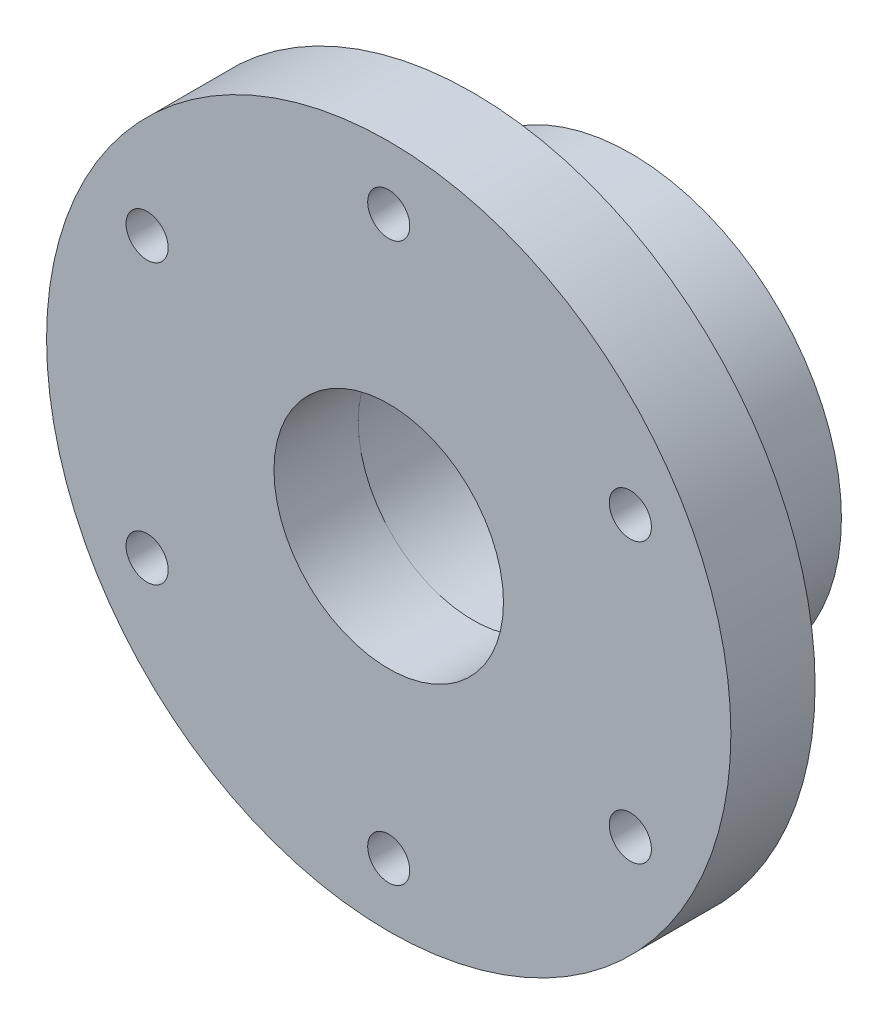
ISO-10303-21;
HEADER;
FILE_DESCRIPTION(('STEP AP214'),'2;1');
FILE_NAME('part.step','',(''),(''),'','','');
FILE_SCHEMA(('AUTOMOTIVE_DESIGN { 1 0 10303 214 1 1 1 1 }'));
ENDSEC;
DATA;
#1=APPLICATION_CONTEXT('core data for automotive mechanical design processes');
#2=APPLICATION_PROTOCOL_DEFINITION('international standard','automotive_design',2000,#1);
#3=PRODUCT_CONTEXT('',#1,'mechanical');
#4=PRODUCT('Part','Part','',(#3));
#5=PRODUCT_RELATED_PRODUCT_CATEGORY('part','',(#4));
#6=PRODUCT_DEFINITION_FORMATION('','',#4);
#7=PRODUCT_DEFINITION_CONTEXT('part definition',#1,'design');
#8=PRODUCT_DEFINITION('design','',#6,#7);
#9=PRODUCT_DEFINITION_SHAPE('','',#8);
#10=(LENGTH_UNIT() NAMED_UNIT(*) SI_UNIT(.MILLI.,.METRE.));
#11=(NAMED_UNIT(*) PLANE_ANGLE_UNIT() SI_UNIT($,.RADIAN.));
#12=(NAMED_UNIT(*) SI_UNIT($,.STERADIAN.) SOLID_ANGLE_UNIT());
#13=UNCERTAINTY_MEASURE_WITH_UNIT(LENGTH_MEASURE(1.E-05),#10,'distance_accuracy_value','');
#14=(GEOMETRIC_REPRESENTATION_CONTEXT(3) GLOBAL_UNCERTAINTY_ASSIGNED_CONTEXT((#13)) GLOBAL_UNIT_ASSIGNED_CONTEXT((#10,
#11,#12)) REPRESENTATION_CONTEXT('',''));
#15=CARTESIAN_POINT('',(0.,0.,0.));
#16=DIRECTION('',(0.,0.,1.));
#17=DIRECTION('',(1.,0.,0.));
#18=AXIS2_PLACEMENT_3D('',#15,#16,#17);
#19=CARTESIAN_POINT('',(0.,0.,50.));
#20=DIRECTION('',(0.,0.,1.));
#21=DIRECTION('',(1.,0.,0.));
#22=AXIS2_PLACEMENT_3D('',#19,#20,#21);
#23=PLANE('',#22);
#24=CARTESIAN_POINT('',(0.,0.,50.));
#25=DIRECTION('',(0.,0.,1.));
#26=DIRECTION('',(1.,0.,0.));
#27=AXIS2_PLACEMENT_3D('',#24,#25,#26);
#28=CIRCLE('',#27,20.);
#29=CARTESIAN_POINT('',(20.,0.,50.));
#30=VERTEX_POINT('',#29);
#31=EDGE_CURVE('E33',#30,#30,#28,.T.);
#32=ORIENTED_EDGE('',*,*,#31,.F.);
#33=EDGE_LOOP('',(#32));
#34=FACE_BOUND('',#33,.T.);
#35=CARTESIAN_POINT('',(0.,0.,50.));
#36=DIRECTION('',(0.,0.,1.));
#37=DIRECTION('',(1.,0.,0.));
#38=AXIS2_PLACEMENT_3D('',#35,#36,#37);
#39=CIRCLE('',#38,11.);
#40=CARTESIAN_POINT('',(11.,0.,50.));
#41=VERTEX_POINT('',#40);
#42=EDGE_CURVE('E40',#41,#41,#39,.T.);
#43=ORIENTED_EDGE('',*,*,#42,.T.);
#44=EDGE_LOOP('',(#43));
#45=FACE_BOUND('',#44,.T.);
#46=ADVANCED_FACE('F29',(#34,#45),#23,.F.);
#47=CARTESIAN_POINT('',(0.,0.,65.));
#48=DIRECTION('',(0.,0.,-1.));
#49=DIRECTION('',(-1.,0.,0.));
#50=AXIS2_PLACEMENT_3D('',#47,#48,#49);
#51=CYLINDRICAL_SURFACE('',#50,20.);
#52=CARTESIAN_POINT('',(0.,0.,65.));
#53=DIRECTION('',(0.,0.,1.));
#54=DIRECTION('',(1.,0.,0.));
#55=AXIS2_PLACEMENT_3D('',#52,#53,#54);
#56=CIRCLE('',#55,20.);
#57=CARTESIAN_POINT('',(20.,0.,65.));
#58=VERTEX_POINT('',#57);
#59=EDGE_CURVE('E10',#58,#58,#56,.T.);
#60=ORIENTED_EDGE('',*,*,#59,.F.);
#61=EDGE_LOOP('',(#60));
#62=FACE_BOUND('',#61,.T.);
#63=ORIENTED_EDGE('',*,*,#31,.T.);
#64=EDGE_LOOP('',(#63));
#65=FACE_BOUND('',#64,.T.);
#66=ADVANCED_FACE('F31',(#62,#65),#51,.T.);
#67=CARTESIAN_POINT('',(0.,0.,65.));
#68=DIRECTION('',(0.,0.,-1.));
#69=DIRECTION('',(-1.,0.,0.));
#70=AXIS2_PLACEMENT_3D('',#67,#68,#69);
#71=CYLINDRICAL_SURFACE('',#70,11.);
#72=CARTESIAN_POINT('',(0.,0.,65.));
#73=DIRECTION('',(0.,0.,1.));
#74=DIRECTION('',(1.,0.,0.));
#75=AXIS2_PLACEMENT_3D('',#72,#73,#74);
#76=CIRCLE('',#75,11.);
#77=CARTESIAN_POINT('',(11.,0.,65.));
#78=VERTEX_POINT('',#77);
#79=EDGE_CURVE('E44',#78,#78,#76,.T.);
#80=ORIENTED_EDGE('',*,*,#79,.T.);
#81=EDGE_LOOP('',(#80));
#82=FACE_BOUND('',#81,.T.);
#83=ORIENTED_EDGE('',*,*,#42,.F.);
#84=EDGE_LOOP('',(#83));
#85=FACE_BOUND('',#84,.T.);
#86=ADVANCED_FACE('F109',(#82,#85),#71,.F.);
#87=CARTESIAN_POINT('',(0.,0.,65.));
#88=DIRECTION('',(0.,0.,1.));
#89=DIRECTION('',(1.,0.,0.));
#90=AXIS2_PLACEMENT_3D('',#87,#88,#89);
#91=PLANE('',#90);
#92=CARTESIAN_POINT('',(22.9496732002876,13.25,65.));
#93=DIRECTION('',(0.,0.,-1.));
#94=DIRECTION('',(-1.,0.,0.));
#95=AXIS2_PLACEMENT_3D('',#92,#93,#94);
#96=CIRCLE('',#95,2.);
#97=CARTESIAN_POINT('',(20.9496732002876,13.25,65.));
#98=VERTEX_POINT('',#97);
#99=EDGE_CURVE('E90',#98,#98,#96,.T.);
#100=ORIENTED_EDGE('',*,*,#99,.F.);
#101=EDGE_LOOP('',(#100));
#102=FACE_BOUND('',#101,.T.);
#103=CARTESIAN_POINT('',(22.9496732002876,-13.25,65.));
#104=DIRECTION('',(0.,0.,-1.));
#105=DIRECTION('',(-1.,0.,0.));
#106=AXIS2_PLACEMENT_3D('',#103,#104,#105);
#107=CIRCLE('',#106,2.);
#108=CARTESIAN_POINT('',(20.9496732002876,-13.25,65.));
#109=VERTEX_POINT('',#108);
#110=EDGE_CURVE('E84',#109,#109,#107,.T.);
#111=ORIENTED_EDGE('',*,*,#110,.F.);
#112=EDGE_LOOP('',(#111));
#113=FACE_BOUND('',#112,.T.);
#114=CARTESIAN_POINT('',(0.,-26.5,65.));
#115=DIRECTION('',(0.,0.,-1.));
#116=DIRECTION('',(-1.,0.,0.));
#117=AXIS2_PLACEMENT_3D('',#114,#115,#116);
#118=CIRCLE('',#117,2.);
#119=CARTESIAN_POINT('',(-2.00000000000001,-26.5,65.));
#120=VERTEX_POINT('',#119);
#121=EDGE_CURVE('E78',#120,#120,#118,.T.);
#122=ORIENTED_EDGE('',*,*,#121,.F.);
#123=EDGE_LOOP('',(#122));
#124=FACE_BOUND('',#123,.T.);
#125=CARTESIAN_POINT('',(-22.9496732002876,-13.25,65.));
#126=DIRECTION('',(0.,0.,-1.));
#127=DIRECTION('',(-1.,0.,0.));
#128=AXIS2_PLACEMENT_3D('',#125,#126,#127);
#129=CIRCLE('',#128,2.);
#130=CARTESIAN_POINT('',(-24.9496732002876,-13.25,65.));
#131=VERTEX_POINT('',#130);
#132=EDGE_CURVE('E72',#131,#131,#129,.T.);
#133=ORIENTED_EDGE('',*,*,#132,.F.);
#134=EDGE_LOOP('',(#133));
#135=FACE_BOUND('',#134,.T.);
#136=CARTESIAN_POINT('',(-22.9496732002876,13.25,65.));
#137=DIRECTION('',(0.,0.,-1.));
#138=DIRECTION('',(-1.,0.,0.));
#139=AXIS2_PLACEMENT_3D('',#136,#137,#138);
#140=CIRCLE('',#139,2.);
#141=CARTESIAN_POINT('',(-24.9496732002876,13.25,65.));
#142=VERTEX_POINT('',#141);
#143=EDGE_CURVE('E66',#142,#142,#140,.T.);
#144=ORIENTED_EDGE('',*,*,#143,.F.);
#145=EDGE_LOOP('',(#144));
#146=FACE_BOUND('',#145,.T.);
#147=CARTESIAN_POINT('',(0.,26.5,65.));
#148=DIRECTION('',(0.,0.,-1.));
#149=DIRECTION('',(-1.,0.,0.));
#150=AXIS2_PLACEMENT_3D('',#147,#148,#149);
#151=CIRCLE('',#150,2.);
#152=CARTESIAN_POINT('',(-2.,26.5,65.));
#153=VERTEX_POINT('',#152);
#154=EDGE_CURVE('E60',#153,#153,#151,.T.);
#155=ORIENTED_EDGE('',*,*,#154,.F.);
#156=EDGE_LOOP('',(#155));
#157=FACE_BOUND('',#156,.T.);
#158=CARTESIAN_POINT('',(0.,0.,65.));
#159=DIRECTION('',(0.,0.,1.));
#160=DIRECTION('',(1.,0.,0.));
#161=AXIS2_PLACEMENT_3D('',#158,#159,#160);
#162=CIRCLE('',#161,32.5);
#163=CARTESIAN_POINT('',(32.5,0.,65.));
#164=VERTEX_POINT('',#163);
#165=EDGE_CURVE('E48',#164,#164,#162,.T.);
#166=ORIENTED_EDGE('',*,*,#165,.F.);
#167=EDGE_LOOP('',(#166));
#168=FACE_BOUND('',#167,.T.);
#169=ORIENTED_EDGE('',*,*,#59,.T.);
#170=EDGE_LOOP('',(#169));
#171=FACE_BOUND('',#170,.T.);
#172=ADVANCED_FACE('F106',(#102,#113,#124,#135,#146,#157,#168,#171),#91,.F.);
#173=CARTESIAN_POINT('',(0.,0.,73.));
#174=DIRECTION('',(0.,0.,1.));
#175=DIRECTION('',(1.,0.,0.));
#176=AXIS2_PLACEMENT_3D('',#173,#174,#175);
#177=PLANE('',#176);
#178=CARTESIAN_POINT('',(22.9496732002876,13.25,73.));
#179=DIRECTION('',(0.,0.,-1.));
#180=DIRECTION('',(-1.,0.,0.));
#181=AXIS2_PLACEMENT_3D('',#178,#179,#180);
#182=CIRCLE('',#181,2.);
#183=CARTESIAN_POINT('',(20.9496732002876,13.25,73.));
#184=VERTEX_POINT('',#183);
#185=EDGE_CURVE('E87',#184,#184,#182,.T.);
#186=ORIENTED_EDGE('',*,*,#185,.T.);
#187=EDGE_LOOP('',(#186));
#188=FACE_BOUND('',#187,.T.);
#189=CARTESIAN_POINT('',(22.9496732002876,-13.25,73.));
#190=DIRECTION('',(0.,0.,-1.));
#191=DIRECTION('',(-1.,0.,0.));
#192=AXIS2_PLACEMENT_3D('',#189,#190,#191);
#193=CIRCLE('',#192,2.);
#194=CARTESIAN_POINT('',(20.9496732002876,-13.25,73.));
#195=VERTEX_POINT('',#194);
#196=EDGE_CURVE('E81',#195,#195,#193,.T.);
#197=ORIENTED_EDGE('',*,*,#196,.T.);
#198=EDGE_LOOP('',(#197));
#199=FACE_BOUND('',#198,.T.);
#200=CARTESIAN_POINT('',(0.,-26.5,73.));
#201=DIRECTION('',(0.,0.,-1.));
#202=DIRECTION('',(-1.,0.,0.));
#203=AXIS2_PLACEMENT_3D('',#200,#201,#202);
#204=CIRCLE('',#203,2.);
#205=CARTESIAN_POINT('',(-2.00000000000001,-26.5,73.));
#206=VERTEX_POINT('',#205);
#207=EDGE_CURVE('E75',#206,#206,#204,.T.);
#208=ORIENTED_EDGE('',*,*,#207,.T.);
#209=EDGE_LOOP('',(#208));
#210=FACE_BOUND('',#209,.T.);
#211=CARTESIAN_POINT('',(-22.9496732002876,-13.25,73.));
#212=DIRECTION('',(0.,0.,-1.));
#213=DIRECTION('',(-1.,0.,0.));
#214=AXIS2_PLACEMENT_3D('',#211,#212,#213);
#215=CIRCLE('',#214,2.);
#216=CARTESIAN_POINT('',(-24.9496732002876,-13.25,73.));
#217=VERTEX_POINT('',#216);
#218=EDGE_CURVE('E69',#217,#217,#215,.T.);
#219=ORIENTED_EDGE('',*,*,#218,.T.);
#220=EDGE_LOOP('',(#219));
#221=FACE_BOUND('',#220,.T.);
#222=CARTESIAN_POINT('',(-22.9496732002876,13.25,73.));
#223=DIRECTION('',(0.,0.,-1.));
#224=DIRECTION('',(-1.,0.,0.));
#225=AXIS2_PLACEMENT_3D('',#222,#223,#224);
#226=CIRCLE('',#225,2.);
#227=CARTESIAN_POINT('',(-24.9496732002876,13.25,73.));
#228=VERTEX_POINT('',#227);
#229=EDGE_CURVE('E63',#228,#228,#226,.T.);
#230=ORIENTED_EDGE('',*,*,#229,.T.);
#231=EDGE_LOOP('',(#230));
#232=FACE_BOUND('',#231,.T.);
#233=CARTESIAN_POINT('',(0.,26.5,73.));
#234=DIRECTION('',(0.,0.,-1.));
#235=DIRECTION('',(-1.,0.,0.));
#236=AXIS2_PLACEMENT_3D('',#233,#234,#235);
#237=CIRCLE('',#236,2.);
#238=CARTESIAN_POINT('',(-2.,26.5,73.));
#239=VERTEX_POINT('',#238);
#240=EDGE_CURVE('E57',#239,#239,#237,.T.);
#241=ORIENTED_EDGE('',*,*,#240,.T.);
#242=EDGE_LOOP('',(#241));
#243=FACE_BOUND('',#242,.T.);
#244=CARTESIAN_POINT('',(0.,0.,73.));
#245=DIRECTION('',(0.,0.,1.));
#246=DIRECTION('',(1.,0.,0.));
#247=AXIS2_PLACEMENT_3D('',#244,#245,#246);
#248=CIRCLE('',#247,32.5);
#249=CARTESIAN_POINT('',(32.5,0.,73.));
#250=VERTEX_POINT('',#249);
#251=EDGE_CURVE('E47',#250,#250,#248,.T.);
#252=ORIENTED_EDGE('',*,*,#251,.T.);
#253=EDGE_LOOP('',(#252));
#254=FACE_BOUND('',#253,.T.);
#255=CARTESIAN_POINT('',(0.,0.,73.));
#256=DIRECTION('',(0.,0.,1.));
#257=DIRECTION('',(1.,0.,0.));
#258=AXIS2_PLACEMENT_3D('',#255,#256,#257);
#259=CIRCLE('',#258,10.9);
#260=CARTESIAN_POINT('',(10.9,0.,73.));
#261=VERTEX_POINT('',#260);
#262=EDGE_CURVE('E51',#261,#261,#259,.T.);
#263=ORIENTED_EDGE('',*,*,#262,.F.);
#264=EDGE_LOOP('',(#263));
#265=FACE_BOUND('',#264,.T.);
#266=ADVANCED_FACE('F96',(#188,#199,#210,#221,#232,#243,#254,#265),#177,.T.);
#267=ORIENTED_EDGE('',*,*,#79,.F.);
#268=EDGE_LOOP('',(#267));
#269=FACE_BOUND('',#268,.T.);
#270=CARTESIAN_POINT('',(0.,0.,65.));
#271=DIRECTION('',(0.,0.,1.));
#272=DIRECTION('',(1.,0.,0.));
#273=AXIS2_PLACEMENT_3D('',#270,#271,#272);
#274=CIRCLE('',#273,10.9);
#275=CARTESIAN_POINT('',(10.9,0.,65.));
#276=VERTEX_POINT('',#275);
#277=EDGE_CURVE('E54',#276,#276,#274,.T.);
#278=ORIENTED_EDGE('',*,*,#277,.T.);
#279=EDGE_LOOP('',(#278));
#280=FACE_BOUND('',#279,.T.);
#281=ADVANCED_FACE('F111',(#269,#280),#91,.F.);
#282=CARTESIAN_POINT('',(0.,0.,73.));
#283=DIRECTION('',(0.,0.,-1.));
#284=DIRECTION('',(-1.,0.,0.));
#285=AXIS2_PLACEMENT_3D('',#282,#283,#284);
#286=CYLINDRICAL_SURFACE('',#285,32.5);
#287=ORIENTED_EDGE('',*,*,#251,.F.);
#288=EDGE_LOOP('',(#287));
#289=FACE_BOUND('',#288,.T.);
#290=ORIENTED_EDGE('',*,*,#165,.T.);
#291=EDGE_LOOP('',(#290));
#292=FACE_BOUND('',#291,.T.);
#293=ADVANCED_FACE('F124',(#289,#292),#286,.T.);
#294=CARTESIAN_POINT('',(0.,0.,73.));
#295=DIRECTION('',(0.,0.,-1.));
#296=DIRECTION('',(-1.,0.,0.));
#297=AXIS2_PLACEMENT_3D('',#294,#295,#296);
#298=CYLINDRICAL_SURFACE('',#297,10.9);
#299=ORIENTED_EDGE('',*,*,#262,.T.);
#300=EDGE_LOOP('',(#299));
#301=FACE_BOUND('',#300,.T.);
#302=ORIENTED_EDGE('',*,*,#277,.F.);
#303=EDGE_LOOP('',(#302));
#304=FACE_BOUND('',#303,.T.);
#305=ADVANCED_FACE('F126',(#301,#304),#298,.F.);
#306=CARTESIAN_POINT('',(0.,26.5,73.));
#307=DIRECTION('',(0.,0.,-1.));
#308=DIRECTION('',(-1.,0.,0.));
#309=AXIS2_PLACEMENT_3D('',#306,#307,#308);
#310=CYLINDRICAL_SURFACE('',#309,2.);
#311=ORIENTED_EDGE('',*,*,#240,.F.);
#312=EDGE_LOOP('',(#311));
#313=FACE_BOUND('',#312,.T.);
#314=ORIENTED_EDGE('',*,*,#154,.T.);
#315=EDGE_LOOP('',(#314));
#316=FACE_BOUND('',#315,.T.);
#317=ADVANCED_FACE('F133',(#313,#316),#310,.F.);
#318=CARTESIAN_POINT('',(-22.9496732002876,13.25,73.));
#319=DIRECTION('',(0.,0.,-1.));
#320=DIRECTION('',(-1.,0.,0.));
#321=AXIS2_PLACEMENT_3D('',#318,#319,#320);
#322=CYLINDRICAL_SURFACE('',#321,2.);
#323=ORIENTED_EDGE('',*,*,#229,.F.);
#324=EDGE_LOOP('',(#323));
#325=FACE_BOUND('',#324,.T.);
#326=ORIENTED_EDGE('',*,*,#143,.T.);
#327=EDGE_LOOP('',(#326));
#328=FACE_BOUND('',#327,.T.);
#329=ADVANCED_FACE('F192',(#325,#328),#322,.F.);
#330=CARTESIAN_POINT('',(-22.9496732002876,-13.25,73.));
#331=DIRECTION('',(0.,0.,-1.));
#332=DIRECTION('',(-1.,0.,0.));
#333=AXIS2_PLACEMENT_3D('',#330,#331,#332);
#334=CYLINDRICAL_SURFACE('',#333,2.);
#335=ORIENTED_EDGE('',*,*,#218,.F.);
#336=EDGE_LOOP('',(#335));
#337=FACE_BOUND('',#336,.T.);
#338=ORIENTED_EDGE('',*,*,#132,.T.);
#339=EDGE_LOOP('',(#338));
#340=FACE_BOUND('',#339,.T.);
#341=ADVANCED_FACE('F199',(#337,#340),#334,.F.);
#342=CARTESIAN_POINT('',(0.,-26.5,73.));
#343=DIRECTION('',(0.,0.,-1.));
#344=DIRECTION('',(-1.,0.,0.));
#345=AXIS2_PLACEMENT_3D('',#342,#343,#344);
#346=CYLINDRICAL_SURFACE('',#345,2.);
#347=ORIENTED_EDGE('',*,*,#207,.F.);
#348=EDGE_LOOP('',(#347));
#349=FACE_BOUND('',#348,.T.);
#350=ORIENTED_EDGE('',*,*,#121,.T.);
#351=EDGE_LOOP('',(#350));
#352=FACE_BOUND('',#351,.T.);
#353=ADVANCED_FACE('F207',(#349,#352),#346,.F.);
#354=CARTESIAN_POINT('',(22.9496732002876,-13.25,73.));
#355=DIRECTION('',(0.,0.,-1.));
#356=DIRECTION('',(-1.,0.,0.));
#357=AXIS2_PLACEMENT_3D('',#354,#355,#356);
#358=CYLINDRICAL_SURFACE('',#357,2.);
#359=ORIENTED_EDGE('',*,*,#196,.F.);
#360=EDGE_LOOP('',(#359));
#361=FACE_BOUND('',#360,.T.);
#362=ORIENTED_EDGE('',*,*,#110,.T.);
#363=EDGE_LOOP('',(#362));
#364=FACE_BOUND('',#363,.T.);
#365=ADVANCED_FACE('F102',(#361,#364),#358,.F.);
#366=CARTESIAN_POINT('',(22.9496732002876,13.25,73.));
#367=DIRECTION('',(0.,0.,-1.));
#368=DIRECTION('',(-1.,0.,0.));
#369=AXIS2_PLACEMENT_3D('',#366,#367,#368);
#370=CYLINDRICAL_SURFACE('',#369,2.);
#371=ORIENTED_EDGE('',*,*,#185,.F.);
#372=EDGE_LOOP('',(#371));
#373=FACE_BOUND('',#372,.T.);
#374=ORIENTED_EDGE('',*,*,#99,.T.);
#375=EDGE_LOOP('',(#374));
#376=FACE_BOUND('',#375,.T.);
#377=ADVANCED_FACE('F99',(#373,#376),#370,.F.);
#378=CLOSED_SHELL('',(#46,#66,#86,#172,#266,#281,#293,#305,#317,#329,#341,#353,#365,#377));
#379=MANIFOLD_SOLID_BREP('B2',#378);
#380=ADVANCED_BREP_SHAPE_REPRESENTATION('',(#18,#379),#14);
#381=SHAPE_DEFINITION_REPRESENTATION(#9,#380);
ENDSEC;
END-ISO-10303-21;
